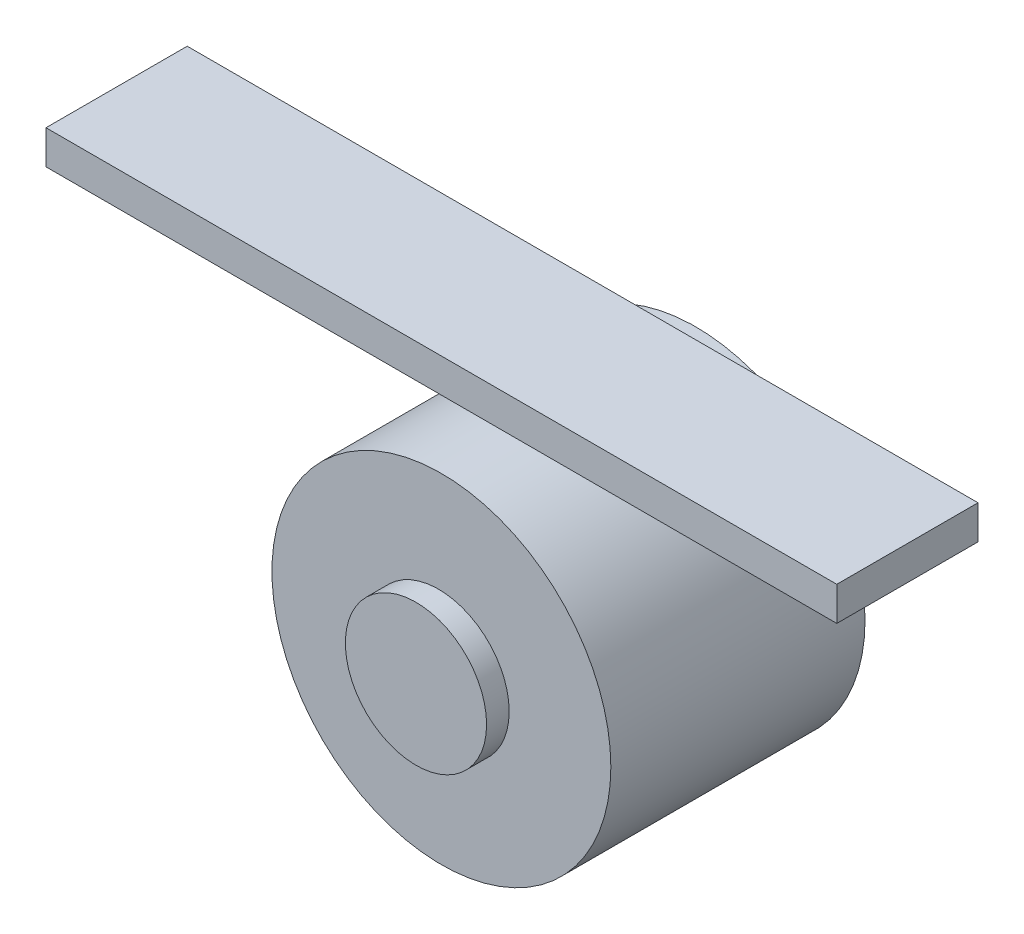
ISO-10303-21;
HEADER;
FILE_DESCRIPTION(('STEP AP214'),'2;1');
FILE_NAME('part.step','',(''),(''),'','','');
FILE_SCHEMA(('AUTOMOTIVE_DESIGN { 1 0 10303 214 1 1 1 1 }'));
ENDSEC;
DATA;
#1=APPLICATION_CONTEXT('core data for automotive mechanical design processes');
#2=APPLICATION_PROTOCOL_DEFINITION('international standard','automotive_design',2000,#1);
#3=PRODUCT_CONTEXT('',#1,'mechanical');
#4=PRODUCT('Part','Part','',(#3));
#5=PRODUCT_RELATED_PRODUCT_CATEGORY('part','',(#4));
#6=PRODUCT_DEFINITION_FORMATION('','',#4);
#7=PRODUCT_DEFINITION_CONTEXT('part definition',#1,'design');
#8=PRODUCT_DEFINITION('design','',#6,#7);
#9=PRODUCT_DEFINITION_SHAPE('','',#8);
#10=(LENGTH_UNIT() NAMED_UNIT(*) SI_UNIT(.MILLI.,.METRE.));
#11=(NAMED_UNIT(*) PLANE_ANGLE_UNIT() SI_UNIT($,.RADIAN.));
#12=(NAMED_UNIT(*) SI_UNIT($,.STERADIAN.) SOLID_ANGLE_UNIT());
#13=UNCERTAINTY_MEASURE_WITH_UNIT(LENGTH_MEASURE(1.E-05),#10,'distance_accuracy_value','');
#14=(GEOMETRIC_REPRESENTATION_CONTEXT(3) GLOBAL_UNCERTAINTY_ASSIGNED_CONTEXT((#13)) GLOBAL_UNIT_ASSIGNED_CONTEXT((#10,
#11,#12)) REPRESENTATION_CONTEXT('',''));
#15=CARTESIAN_POINT('',(0.,0.,0.));
#16=DIRECTION('',(0.,0.,1.));
#17=DIRECTION('',(1.,0.,0.));
#18=AXIS2_PLACEMENT_3D('',#15,#16,#17);
#19=CARTESIAN_POINT('',(14.,8.4,4.5));
#20=DIRECTION('',(-1.,0.,0.));
#21=DIRECTION('',(0.,0.,1.));
#22=AXIS2_PLACEMENT_3D('',#19,#20,#21);
#23=PLANE('',#22);
#24=DIRECTION('',(0.,1.,0.));
#25=VECTOR('',#24,1.);
#26=CARTESIAN_POINT('',(14.,8.4,-0.5));
#27=LINE('',#26,#25);
#28=CARTESIAN_POINT('',(14.,8.4,-0.5));
#29=VERTEX_POINT('',#28);
#30=CARTESIAN_POINT('',(14.,9.6,-0.5));
#31=VERTEX_POINT('',#30);
#32=EDGE_CURVE('E107',#29,#31,#27,.T.);
#33=ORIENTED_EDGE('',*,*,#32,.T.);
#34=DIRECTION('',(0.,0.,-1.));
#35=VECTOR('',#34,1.);
#36=CARTESIAN_POINT('',(14.,9.6,4.5));
#37=LINE('',#36,#35);
#38=CARTESIAN_POINT('',(14.,9.6,4.5));
#39=VERTEX_POINT('',#38);
#40=EDGE_CURVE('E12',#39,#31,#37,.T.);
#41=ORIENTED_EDGE('',*,*,#40,.F.);
#42=DIRECTION('',(0.,1.,0.));
#43=VECTOR('',#42,1.);
#44=CARTESIAN_POINT('',(14.,8.4,4.5));
#45=LINE('',#44,#43);
#46=CARTESIAN_POINT('',(14.,8.4,4.5));
#47=VERTEX_POINT('',#46);
#48=EDGE_CURVE('E95',#47,#39,#45,.T.);
#49=ORIENTED_EDGE('',*,*,#48,.F.);
#50=DIRECTION('',(0.,0.,-1.));
#51=VECTOR('',#50,1.);
#52=CARTESIAN_POINT('',(14.,8.4,4.5));
#53=LINE('',#52,#51);
#54=EDGE_CURVE('E103',#47,#29,#53,.T.);
#55=ORIENTED_EDGE('',*,*,#54,.T.);
#56=EDGE_LOOP('',(#33,#41,#49,#55));
#57=FACE_BOUND('',#56,.T.);
#58=ADVANCED_FACE('F44',(#57),#23,.F.);
#59=CARTESIAN_POINT('',(-14.,9.6,4.5));
#60=DIRECTION('',(0.,-1.,0.));
#61=DIRECTION('',(0.,0.,-1.));
#62=AXIS2_PLACEMENT_3D('',#59,#60,#61);
#63=PLANE('',#62);
#64=DIRECTION('',(-1.,0.,0.));
#65=VECTOR('',#64,1.);
#66=CARTESIAN_POINT('',(-14.,9.6,-0.5));
#67=LINE('',#66,#65);
#68=CARTESIAN_POINT('',(-14.,9.6,-0.5));
#69=VERTEX_POINT('',#68);
#70=EDGE_CURVE('E99',#31,#69,#67,.T.);
#71=ORIENTED_EDGE('',*,*,#70,.T.);
#72=DIRECTION('',(0.,0.,-1.));
#73=VECTOR('',#72,1.);
#74=CARTESIAN_POINT('',(-14.,9.6,4.5));
#75=LINE('',#74,#73);
#76=CARTESIAN_POINT('',(-14.,9.6,4.5));
#77=VERTEX_POINT('',#76);
#78=EDGE_CURVE('E52',#77,#69,#75,.T.);
#79=ORIENTED_EDGE('',*,*,#78,.F.);
#80=DIRECTION('',(-1.,0.,0.));
#81=VECTOR('',#80,1.);
#82=CARTESIAN_POINT('',(-14.,9.6,4.5));
#83=LINE('',#82,#81);
#84=EDGE_CURVE('E90',#39,#77,#83,.T.);
#85=ORIENTED_EDGE('',*,*,#84,.F.);
#86=ORIENTED_EDGE('',*,*,#40,.T.);
#87=EDGE_LOOP('',(#71,#79,#85,#86));
#88=FACE_BOUND('',#87,.T.);
#89=ADVANCED_FACE('F98',(#88),#63,.F.);
#90=CARTESIAN_POINT('',(-14.,8.4,4.5));
#91=DIRECTION('',(1.,0.,0.));
#92=DIRECTION('',(0.,0.,-1.));
#93=AXIS2_PLACEMENT_3D('',#90,#91,#92);
#94=PLANE('',#93);
#95=DIRECTION('',(0.,-1.,0.));
#96=VECTOR('',#95,1.);
#97=CARTESIAN_POINT('',(-14.,8.4,-0.5));
#98=LINE('',#97,#96);
#99=CARTESIAN_POINT('',(-14.,8.4,-0.5));
#100=VERTEX_POINT('',#99);
#101=EDGE_CURVE('E77',#69,#100,#98,.T.);
#102=ORIENTED_EDGE('',*,*,#101,.T.);
#103=DIRECTION('',(0.,0.,-1.));
#104=VECTOR('',#103,1.);
#105=CARTESIAN_POINT('',(-14.,8.4,4.5));
#106=LINE('',#105,#104);
#107=CARTESIAN_POINT('',(-14.,8.4,4.5));
#108=VERTEX_POINT('',#107);
#109=EDGE_CURVE('E100',#108,#100,#106,.T.);
#110=ORIENTED_EDGE('',*,*,#109,.F.);
#111=DIRECTION('',(0.,-1.,0.));
#112=VECTOR('',#111,1.);
#113=CARTESIAN_POINT('',(-14.,8.4,4.5));
#114=LINE('',#113,#112);
#115=EDGE_CURVE('E93',#77,#108,#114,.T.);
#116=ORIENTED_EDGE('',*,*,#115,.F.);
#117=ORIENTED_EDGE('',*,*,#78,.T.);
#118=EDGE_LOOP('',(#102,#110,#116,#117));
#119=FACE_BOUND('',#118,.T.);
#120=ADVANCED_FACE('F101',(#119),#94,.F.);
#121=CARTESIAN_POINT('',(-14.,8.4,4.5));
#122=DIRECTION('',(0.,1.,0.));
#123=DIRECTION('',(0.,0.,1.));
#124=AXIS2_PLACEMENT_3D('',#121,#122,#123);
#125=PLANE('',#124);
#126=DIRECTION('',(1.,0.,0.));
#127=VECTOR('',#126,1.);
#128=CARTESIAN_POINT('',(-14.,8.4,-0.5));
#129=LINE('',#128,#127);
#130=EDGE_CURVE('E83',#100,#29,#129,.T.);
#131=ORIENTED_EDGE('',*,*,#130,.T.);
#132=ORIENTED_EDGE('',*,*,#54,.F.);
#133=DIRECTION('',(1.,0.,0.));
#134=VECTOR('',#133,1.);
#135=CARTESIAN_POINT('',(-14.,8.4,4.5));
#136=LINE('',#135,#134);
#137=EDGE_CURVE('E60',#108,#47,#136,.T.);
#138=ORIENTED_EDGE('',*,*,#137,.F.);
#139=ORIENTED_EDGE('',*,*,#109,.T.);
#140=EDGE_LOOP('',(#131,#132,#138,#139));
#141=FACE_BOUND('',#140,.T.);
#142=ADVANCED_FACE('F114',(#141),#125,.F.);
#143=CARTESIAN_POINT('',(0.,0.,4.5));
#144=DIRECTION('',(0.,0.,-1.));
#145=DIRECTION('',(-1.,0.,0.));
#146=AXIS2_PLACEMENT_3D('',#143,#144,#145);
#147=PLANE('',#146);
#148=ORIENTED_EDGE('',*,*,#48,.T.);
#149=ORIENTED_EDGE('',*,*,#84,.T.);
#150=ORIENTED_EDGE('',*,*,#115,.T.);
#151=ORIENTED_EDGE('',*,*,#137,.T.);
#152=EDGE_LOOP('',(#148,#149,#150,#151));
#153=FACE_BOUND('',#152,.T.);
#154=ADVANCED_FACE('F91',(#153),#147,.F.);
#155=CARTESIAN_POINT('',(0.,0.,-0.5));
#156=DIRECTION('',(0.,0.,-1.));
#157=DIRECTION('',(-1.,0.,0.));
#158=AXIS2_PLACEMENT_3D('',#155,#156,#157);
#159=PLANE('',#158);
#160=ORIENTED_EDGE('',*,*,#32,.F.);
#161=ORIENTED_EDGE('',*,*,#130,.F.);
#162=ORIENTED_EDGE('',*,*,#101,.F.);
#163=ORIENTED_EDGE('',*,*,#70,.F.);
#164=EDGE_LOOP('',(#160,#161,#162,#163));
#165=FACE_BOUND('',#164,.T.);
#166=ADVANCED_FACE('F117',(#165),#159,.T.);
#167=CLOSED_SHELL('',(#58,#89,#120,#142,#154,#166));
#168=MANIFOLD_SOLID_BREP('B2',#167);
#169=CARTESIAN_POINT('',(0.,0.,5.4));
#170=DIRECTION('',(0.,0.,-1.));
#171=DIRECTION('',(-1.,0.,0.));
#172=AXIS2_PLACEMENT_3D('',#169,#170,#171);
#173=CYLINDRICAL_SURFACE('',#172,2.5);
#174=CARTESIAN_POINT('',(0.,0.,5.4));
#175=DIRECTION('',(0.,0.,1.));
#176=DIRECTION('',(1.,0.,0.));
#177=AXIS2_PLACEMENT_3D('',#174,#175,#176);
#178=CIRCLE('',#177,2.5);
#179=CARTESIAN_POINT('',(2.5,0.,5.4));
#180=VERTEX_POINT('',#179);
#181=EDGE_CURVE('E43',#180,#180,#178,.T.);
#182=ORIENTED_EDGE('',*,*,#181,.F.);
#183=EDGE_LOOP('',(#182));
#184=FACE_BOUND('',#183,.T.);
#185=CARTESIAN_POINT('',(0.,0.,4.6));
#186=DIRECTION('',(0.,0.,1.));
#187=DIRECTION('',(1.,0.,0.));
#188=AXIS2_PLACEMENT_3D('',#185,#186,#187);
#189=CIRCLE('',#188,2.5);
#190=CARTESIAN_POINT('',(2.5,0.,4.6));
#191=VERTEX_POINT('',#190);
#192=EDGE_CURVE('E178',#191,#191,#189,.T.);
#193=ORIENTED_EDGE('',*,*,#192,.T.);
#194=EDGE_LOOP('',(#193));
#195=FACE_BOUND('',#194,.T.);
#196=ADVANCED_FACE('F175',(#184,#195),#173,.T.);
#197=CARTESIAN_POINT('',(0.,0.,5.4));
#198=DIRECTION('',(0.,0.,1.));
#199=DIRECTION('',(1.,0.,0.));
#200=AXIS2_PLACEMENT_3D('',#197,#198,#199);
#201=PLANE('',#200);
#202=ORIENTED_EDGE('',*,*,#181,.T.);
#203=EDGE_LOOP('',(#202));
#204=FACE_BOUND('',#203,.T.);
#205=ADVANCED_FACE('F190',(#204),#201,.T.);
#206=CARTESIAN_POINT('',(0.,0.,4.6));
#207=DIRECTION('',(0.,0.,1.));
#208=DIRECTION('',(1.,0.,0.));
#209=AXIS2_PLACEMENT_3D('',#206,#207,#208);
#210=PLANE('',#209);
#211=ORIENTED_EDGE('',*,*,#192,.F.);
#212=EDGE_LOOP('',(#211));
#213=FACE_BOUND('',#212,.T.);
#214=ADVANCED_FACE('F188',(#213),#210,.F.);
#215=CLOSED_SHELL('',(#196,#205,#214));
#216=MANIFOLD_SOLID_BREP('B6',#215);
#217=CARTESIAN_POINT('',(0.,0.,4.5));
#218=DIRECTION('',(0.,0.,-1.));
#219=DIRECTION('',(-1.,0.,0.));
#220=AXIS2_PLACEMENT_3D('',#217,#218,#219);
#221=CYLINDRICAL_SURFACE('',#220,6.);
#222=CARTESIAN_POINT('',(0.,0.,4.5));
#223=DIRECTION('',(0.,0.,1.));
#224=DIRECTION('',(1.,0.,0.));
#225=AXIS2_PLACEMENT_3D('',#222,#223,#224);
#226=CIRCLE('',#225,6.);
#227=CARTESIAN_POINT('',(6.,0.,4.5));
#228=VERTEX_POINT('',#227);
#229=EDGE_CURVE('E174',#228,#228,#226,.T.);
#230=ORIENTED_EDGE('',*,*,#229,.F.);
#231=EDGE_LOOP('',(#230));
#232=FACE_BOUND('',#231,.T.);
#233=CARTESIAN_POINT('',(0.,0.,-4.5));
#234=DIRECTION('',(0.,0.,1.));
#235=DIRECTION('',(1.,0.,0.));
#236=AXIS2_PLACEMENT_3D('',#233,#234,#235);
#237=CIRCLE('',#236,6.);
#238=CARTESIAN_POINT('',(6.,0.,-4.5));
#239=VERTEX_POINT('',#238);
#240=EDGE_CURVE('E219',#239,#239,#237,.T.);
#241=ORIENTED_EDGE('',*,*,#240,.T.);
#242=EDGE_LOOP('',(#241));
#243=FACE_BOUND('',#242,.T.);
#244=ADVANCED_FACE('F216',(#232,#243),#221,.T.);
#245=CARTESIAN_POINT('',(0.,0.,4.5));
#246=DIRECTION('',(0.,0.,1.));
#247=DIRECTION('',(1.,0.,0.));
#248=AXIS2_PLACEMENT_3D('',#245,#246,#247);
#249=PLANE('',#248);
#250=ORIENTED_EDGE('',*,*,#229,.T.);
#251=EDGE_LOOP('',(#250));
#252=FACE_BOUND('',#251,.T.);
#253=ADVANCED_FACE('F231',(#252),#249,.T.);
#254=CARTESIAN_POINT('',(0.,0.,-4.5));
#255=DIRECTION('',(0.,0.,1.));
#256=DIRECTION('',(1.,0.,0.));
#257=AXIS2_PLACEMENT_3D('',#254,#255,#256);
#258=PLANE('',#257);
#259=ORIENTED_EDGE('',*,*,#240,.F.);
#260=EDGE_LOOP('',(#259));
#261=FACE_BOUND('',#260,.T.);
#262=ADVANCED_FACE('F229',(#261),#258,.F.);
#263=CLOSED_SHELL('',(#244,#253,#262));
#264=MANIFOLD_SOLID_BREP('B38',#263);
#265=ADVANCED_BREP_SHAPE_REPRESENTATION('',(#18,#168,#216,#264),#14);
#266=SHAPE_DEFINITION_REPRESENTATION(#9,#265);
ENDSEC;
END-ISO-10303-21;
